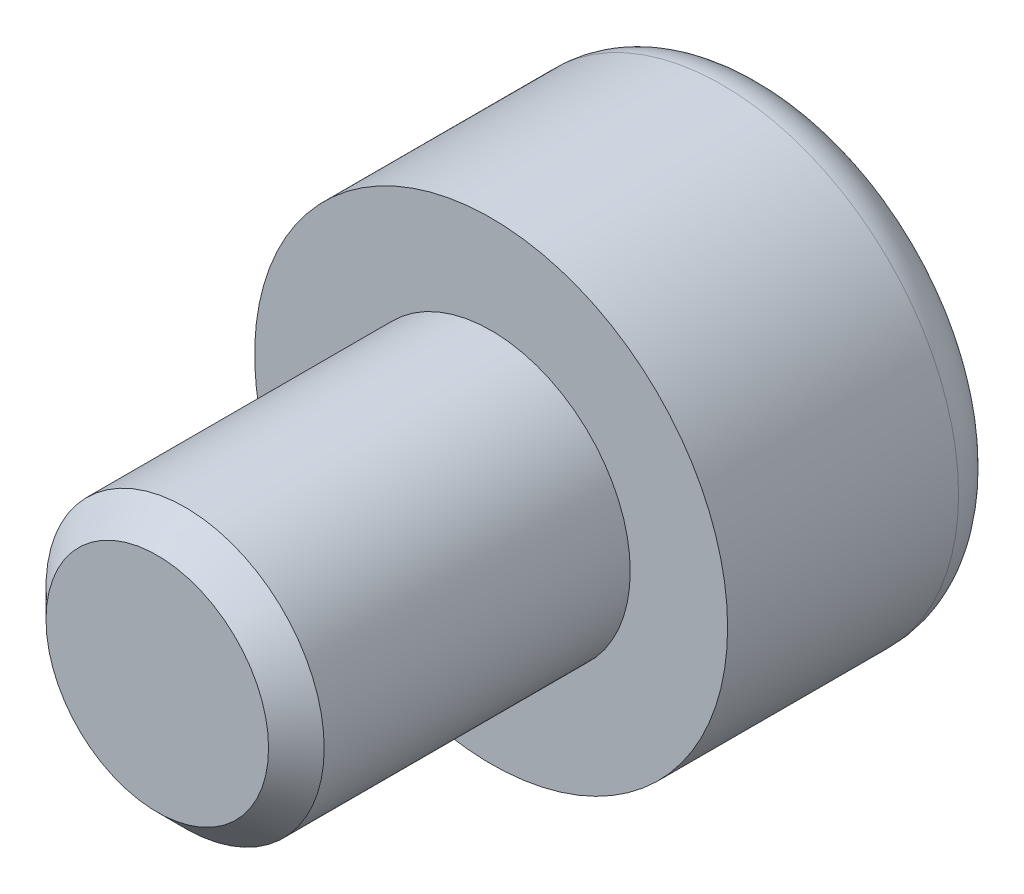
ISO-10303-21;
HEADER;
FILE_DESCRIPTION(('STEP AP214'),'2;1');
FILE_NAME('part.step','',(''),(''),'','','');
FILE_SCHEMA(('AUTOMOTIVE_DESIGN { 1 0 10303 214 1 1 1 1 }'));
ENDSEC;
DATA;
#1=APPLICATION_CONTEXT('core data for automotive mechanical design processes');
#2=APPLICATION_PROTOCOL_DEFINITION('international standard','automotive_design',2000,#1);
#3=PRODUCT_CONTEXT('',#1,'mechanical');
#4=PRODUCT('Part','Part','',(#3));
#5=PRODUCT_RELATED_PRODUCT_CATEGORY('part','',(#4));
#6=PRODUCT_DEFINITION_FORMATION('','',#4);
#7=PRODUCT_DEFINITION_CONTEXT('part definition',#1,'design');
#8=PRODUCT_DEFINITION('design','',#6,#7);
#9=PRODUCT_DEFINITION_SHAPE('','',#8);
#10=(LENGTH_UNIT() NAMED_UNIT(*) SI_UNIT(.MILLI.,.METRE.));
#11=(NAMED_UNIT(*) PLANE_ANGLE_UNIT() SI_UNIT($,.RADIAN.));
#12=(NAMED_UNIT(*) SI_UNIT($,.STERADIAN.) SOLID_ANGLE_UNIT());
#13=UNCERTAINTY_MEASURE_WITH_UNIT(LENGTH_MEASURE(1.E-05),#10,'distance_accuracy_value','');
#14=(GEOMETRIC_REPRESENTATION_CONTEXT(3) GLOBAL_UNCERTAINTY_ASSIGNED_CONTEXT((#13)) GLOBAL_UNIT_ASSIGNED_CONTEXT((#10,
#11,#12)) REPRESENTATION_CONTEXT('',''));
#15=CARTESIAN_POINT('',(0.,0.,0.));
#16=DIRECTION('',(0.,0.,1.));
#17=DIRECTION('',(1.,0.,0.));
#18=AXIS2_PLACEMENT_3D('',#15,#16,#17);
#19=CARTESIAN_POINT('',(0.,0.,6.));
#20=DIRECTION('',(0.,0.,-1.));
#21=DIRECTION('',(1.,0.,0.));
#22=AXIS2_PLACEMENT_3D('',#19,#20,#21);
#23=PLANE('',#22);
#24=CARTESIAN_POINT('',(0.,0.,6.));
#25=DIRECTION('',(0.,0.,1.));
#26=DIRECTION('',(1.,0.,0.));
#27=AXIS2_PLACEMENT_3D('',#24,#25,#26);
#28=CIRCLE('',#27,2.);
#29=CARTESIAN_POINT('',(2.,0.,6.));
#30=VERTEX_POINT('',#29);
#31=EDGE_CURVE('E11',#30,#30,#28,.T.);
#32=ORIENTED_EDGE('',*,*,#31,.T.);
#33=EDGE_LOOP('',(#32));
#34=FACE_BOUND('',#33,.T.);
#35=ADVANCED_FACE('F41',(#34),#23,.F.);
#36=CARTESIAN_POINT('',(0.,0.,6.));
#37=DIRECTION('',(0.,0.,-1.));
#38=DIRECTION('',(1.,0.,0.));
#39=AXIS2_PLACEMENT_3D('',#36,#37,#38);
#40=CONICAL_SURFACE('',#39,2.,0.785398163397);
#41=ORIENTED_EDGE('',*,*,#31,.F.);
#42=DIRECTION('',(0.707106781186548,0.,-0.707106781186548));
#43=VECTOR('',#42,1.);
#44=CARTESIAN_POINT('',(2.,0.,6.));
#45=LINE('',#44,#43);
#46=CARTESIAN_POINT('',(2.5,0.,5.5));
#47=VERTEX_POINT('',#46);
#48=EDGE_CURVE('E52',#30,#47,#45,.T.);
#49=ORIENTED_EDGE('',*,*,#48,.T.);
#50=CARTESIAN_POINT('',(0.,0.,5.5));
#51=DIRECTION('',(0.,0.,1.));
#52=DIRECTION('',(1.,0.,0.));
#53=AXIS2_PLACEMENT_3D('',#50,#51,#52);
#54=CIRCLE('',#53,2.5);
#55=EDGE_CURVE('E220',#47,#47,#54,.T.);
#56=ORIENTED_EDGE('',*,*,#55,.T.);
#57=ORIENTED_EDGE('',*,*,#48,.F.);
#58=EDGE_LOOP('',(#41,#49,#56,#57));
#59=FACE_BOUND('',#58,.T.);
#60=ADVANCED_FACE('F234',(#59),#40,.T.);
#61=CARTESIAN_POINT('',(0.,0.,5.5));
#62=DIRECTION('',(0.,0.,-1.));
#63=DIRECTION('',(1.,0.,0.));
#64=AXIS2_PLACEMENT_3D('',#61,#62,#63);
#65=CYLINDRICAL_SURFACE('',#64,2.5);
#66=ORIENTED_EDGE('',*,*,#55,.F.);
#67=DIRECTION('',(0.,0.,-1.));
#68=VECTOR('',#67,1.);
#69=CARTESIAN_POINT('',(2.5,0.,5.5));
#70=LINE('',#69,#68);
#71=CARTESIAN_POINT('',(2.5,0.,0.));
#72=VERTEX_POINT('',#71);
#73=EDGE_CURVE('E200',#47,#72,#70,.T.);
#74=ORIENTED_EDGE('',*,*,#73,.T.);
#75=CARTESIAN_POINT('',(0.,0.,0.));
#76=DIRECTION('',(0.,0.,1.));
#77=DIRECTION('',(1.,0.,0.));
#78=AXIS2_PLACEMENT_3D('',#75,#76,#77);
#79=CIRCLE('',#78,2.5);
#80=EDGE_CURVE('E190',#72,#72,#79,.T.);
#81=ORIENTED_EDGE('',*,*,#80,.T.);
#82=ORIENTED_EDGE('',*,*,#73,.F.);
#83=EDGE_LOOP('',(#66,#74,#81,#82));
#84=FACE_BOUND('',#83,.T.);
#85=ADVANCED_FACE('F242',(#84),#65,.T.);
#86=CARTESIAN_POINT('',(0.,0.,0.));
#87=DIRECTION('',(0.,0.,-1.));
#88=DIRECTION('',(1.,0.,0.));
#89=AXIS2_PLACEMENT_3D('',#86,#87,#88);
#90=PLANE('',#89);
#91=ORIENTED_EDGE('',*,*,#80,.F.);
#92=EDGE_LOOP('',(#91));
#93=FACE_BOUND('',#92,.T.);
#94=CARTESIAN_POINT('',(0.,0.,0.));
#95=DIRECTION('',(0.,0.,1.));
#96=DIRECTION('',(1.,0.,0.));
#97=AXIS2_PLACEMENT_3D('',#94,#95,#96);
#98=CIRCLE('',#97,4.25);
#99=CARTESIAN_POINT('',(4.25,0.,0.));
#100=VERTEX_POINT('',#99);
#101=EDGE_CURVE('E186',#100,#100,#98,.T.);
#102=ORIENTED_EDGE('',*,*,#101,.T.);
#103=EDGE_LOOP('',(#102));
#104=FACE_BOUND('',#103,.T.);
#105=ADVANCED_FACE('F247',(#93,#104),#90,.F.);
#106=CARTESIAN_POINT('',(0.,0.,0.));
#107=DIRECTION('',(0.,0.,-1.));
#108=DIRECTION('',(1.,0.,0.));
#109=AXIS2_PLACEMENT_3D('',#106,#107,#108);
#110=CYLINDRICAL_SURFACE('',#109,4.25);
#111=ORIENTED_EDGE('',*,*,#101,.F.);
#112=DIRECTION('',(0.,0.,-1.));
#113=VECTOR('',#112,1.);
#114=CARTESIAN_POINT('',(4.25,0.,0.));
#115=LINE('',#114,#113);
#116=CARTESIAN_POINT('',(4.25,0.,-4.15));
#117=VERTEX_POINT('',#116);
#118=EDGE_CURVE('E191',#100,#117,#115,.T.);
#119=ORIENTED_EDGE('',*,*,#118,.T.);
#120=CARTESIAN_POINT('',(0.,0.,-4.15));
#121=DIRECTION('',(0.,0.,1.));
#122=DIRECTION('',(1.,0.,0.));
#123=AXIS2_PLACEMENT_3D('',#120,#121,#122);
#124=CIRCLE('',#123,4.25);
#125=EDGE_CURVE('E173',#117,#117,#124,.T.);
#126=ORIENTED_EDGE('',*,*,#125,.T.);
#127=ORIENTED_EDGE('',*,*,#118,.F.);
#128=EDGE_LOOP('',(#111,#119,#126,#127));
#129=FACE_BOUND('',#128,.T.);
#130=ADVANCED_FACE('F250',(#129),#110,.T.);
#131=CARTESIAN_POINT('',(0.,0.,-4.15));
#132=DIRECTION('',(0.,0.,-1.));
#133=DIRECTION('',(1.,0.,0.));
#134=AXIS2_PLACEMENT_3D('',#131,#132,#133);
#135=TOROIDAL_SURFACE('',#134,3.4,0.85);
#136=ORIENTED_EDGE('',*,*,#125,.F.);
#137=CARTESIAN_POINT('',(3.4,0.,-4.15));
#138=DIRECTION('',(0.,1.,0.));
#139=DIRECTION('',(1.,0.,0.));
#140=AXIS2_PLACEMENT_3D('',#137,#138,#139);
#141=CIRCLE('',#140,0.85);
#142=CARTESIAN_POINT('',(3.4,0.,-5.));
#143=VERTEX_POINT('',#142);
#144=EDGE_CURVE('E181',#117,#143,#141,.T.);
#145=ORIENTED_EDGE('',*,*,#144,.T.);
#146=CARTESIAN_POINT('',(0.,0.,-5.));
#147=DIRECTION('',(0.,0.,1.));
#148=DIRECTION('',(1.,0.,0.));
#149=AXIS2_PLACEMENT_3D('',#146,#147,#148);
#150=CIRCLE('',#149,3.4);
#151=EDGE_CURVE('E176',#143,#143,#150,.T.);
#152=ORIENTED_EDGE('',*,*,#151,.T.);
#153=ORIENTED_EDGE('',*,*,#144,.F.);
#154=EDGE_LOOP('',(#136,#145,#152,#153));
#155=FACE_BOUND('',#154,.T.);
#156=ADVANCED_FACE('F255',(#155),#135,.T.);
#157=CARTESIAN_POINT('',(0.,0.,-5.));
#158=DIRECTION('',(0.,0.,-1.));
#159=DIRECTION('',(1.,0.,0.));
#160=AXIS2_PLACEMENT_3D('',#157,#158,#159);
#161=PLANE('',#160);
#162=ORIENTED_EDGE('',*,*,#151,.F.);
#163=EDGE_LOOP('',(#162));
#164=FACE_BOUND('',#163,.T.);
#165=DIRECTION('',(1.,0.,0.));
#166=VECTOR('',#165,1.);
#167=CARTESIAN_POINT('',(-1.155,-2.000518682742,-5.));
#168=LINE('',#167,#166);
#169=CARTESIAN_POINT('',(-1.155,-2.000518682742,-5.));
#170=VERTEX_POINT('',#169);
#171=CARTESIAN_POINT('',(1.155,-2.000518682742,-5.));
#172=VERTEX_POINT('',#171);
#173=EDGE_CURVE('E184',#170,#172,#168,.T.);
#174=ORIENTED_EDGE('',*,*,#173,.T.);
#175=DIRECTION('',(0.50000000000019,0.866025403784329,0.));
#176=VECTOR('',#175,1.);
#177=CARTESIAN_POINT('',(1.155,-2.000518682742,-5.));
#178=LINE('',#177,#176);
#179=CARTESIAN_POINT('',(2.31,0.,-5.));
#180=VERTEX_POINT('',#179);
#181=EDGE_CURVE('E177',#172,#180,#178,.T.);
#182=ORIENTED_EDGE('',*,*,#181,.T.);
#183=DIRECTION('',(-0.50000000000019,0.866025403784329,0.));
#184=VECTOR('',#183,1.);
#185=CARTESIAN_POINT('',(2.31,0.,-5.));
#186=LINE('',#185,#184);
#187=CARTESIAN_POINT('',(1.155,2.000518682742,-5.));
#188=VERTEX_POINT('',#187);
#189=EDGE_CURVE('E150',#180,#188,#186,.T.);
#190=ORIENTED_EDGE('',*,*,#189,.T.);
#191=DIRECTION('',(-1.,0.,0.));
#192=VECTOR('',#191,1.);
#193=CARTESIAN_POINT('',(1.155,2.000518682742,-5.));
#194=LINE('',#193,#192);
#195=CARTESIAN_POINT('',(-1.155,2.000518682742,-5.));
#196=VERTEX_POINT('',#195);
#197=EDGE_CURVE('E159',#188,#196,#194,.T.);
#198=ORIENTED_EDGE('',*,*,#197,.T.);
#199=DIRECTION('',(-0.50000000000019,-0.866025403784329,0.));
#200=VECTOR('',#199,1.);
#201=CARTESIAN_POINT('',(-1.155,2.000518682742,-5.));
#202=LINE('',#201,#200);
#203=CARTESIAN_POINT('',(-2.31,0.,-5.));
#204=VERTEX_POINT('',#203);
#205=EDGE_CURVE('E45',#196,#204,#202,.T.);
#206=ORIENTED_EDGE('',*,*,#205,.T.);
#207=DIRECTION('',(0.50000000000019,-0.866025403784329,0.));
#208=VECTOR('',#207,1.);
#209=CARTESIAN_POINT('',(-2.31,0.,-5.));
#210=LINE('',#209,#208);
#211=EDGE_CURVE('E204',#204,#170,#210,.T.);
#212=ORIENTED_EDGE('',*,*,#211,.T.);
#213=EDGE_LOOP('',(#174,#182,#190,#198,#206,#212));
#214=FACE_BOUND('',#213,.T.);
#215=ADVANCED_FACE('F258',(#164,#214),#161,.T.);
#216=CARTESIAN_POINT('',(1.155,-2.000518682742,-2.5));
#217=DIRECTION('',(-0.866025403784329,0.50000000000019,0.));
#218=DIRECTION('',(0.,0.,-1.));
#219=AXIS2_PLACEMENT_3D('',#216,#217,#218);
#220=PLANE('',#219);
#221=DIRECTION('',(0.,0.,-1.));
#222=VECTOR('',#221,1.);
#223=CARTESIAN_POINT('',(1.155,-2.000518682742,-2.5));
#224=LINE('',#223,#222);
#225=CARTESIAN_POINT('',(1.155,-2.000518682742,-2.5));
#226=VERTEX_POINT('',#225);
#227=EDGE_CURVE('E139',#226,#172,#224,.T.);
#228=ORIENTED_EDGE('',*,*,#227,.F.);
#229=DIRECTION('',(0.50000000000019,0.866025403784329,0.));
#230=VECTOR('',#229,1.);
#231=CARTESIAN_POINT('',(1.155,-2.000518682742,-2.5));
#232=LINE('',#231,#230);
#233=CARTESIAN_POINT('',(2.31,0.,-2.5));
#234=VERTEX_POINT('',#233);
#235=EDGE_CURVE('E148',#226,#234,#232,.T.);
#236=ORIENTED_EDGE('',*,*,#235,.T.);
#237=DIRECTION('',(0.,0.,-1.));
#238=VECTOR('',#237,1.);
#239=CARTESIAN_POINT('',(2.31,0.,-2.5));
#240=LINE('',#239,#238);
#241=EDGE_CURVE('E153',#234,#180,#240,.T.);
#242=ORIENTED_EDGE('',*,*,#241,.T.);
#243=ORIENTED_EDGE('',*,*,#181,.F.);
#244=EDGE_LOOP('',(#228,#236,#242,#243));
#245=FACE_BOUND('',#244,.T.);
#246=ADVANCED_FACE('F161',(#245),#220,.T.);
#247=CARTESIAN_POINT('',(-1.155,-2.000518682742,-2.5));
#248=DIRECTION('',(0.,1.,0.));
#249=DIRECTION('',(1.,0.,0.));
#250=AXIS2_PLACEMENT_3D('',#247,#248,#249);
#251=PLANE('',#250);
#252=DIRECTION('',(0.,0.,-1.));
#253=VECTOR('',#252,1.);
#254=CARTESIAN_POINT('',(-1.155,-2.000518682742,-2.5));
#255=LINE('',#254,#253);
#256=CARTESIAN_POINT('',(-1.155,-2.000518682742,-2.5));
#257=VERTEX_POINT('',#256);
#258=EDGE_CURVE('E182',#257,#170,#255,.T.);
#259=ORIENTED_EDGE('',*,*,#258,.F.);
#260=DIRECTION('',(1.,0.,0.));
#261=VECTOR('',#260,1.);
#262=CARTESIAN_POINT('',(-1.155,-2.000518682742,-2.5));
#263=LINE('',#262,#261);
#264=EDGE_CURVE('E163',#257,#226,#263,.T.);
#265=ORIENTED_EDGE('',*,*,#264,.T.);
#266=ORIENTED_EDGE('',*,*,#227,.T.);
#267=ORIENTED_EDGE('',*,*,#173,.F.);
#268=EDGE_LOOP('',(#259,#265,#266,#267));
#269=FACE_BOUND('',#268,.T.);
#270=ADVANCED_FACE('F265',(#269),#251,.T.);
#271=CARTESIAN_POINT('',(-2.31,0.,-2.5));
#272=DIRECTION('',(0.866025403784329,0.50000000000019,0.));
#273=DIRECTION('',(0.,0.,1.));
#274=AXIS2_PLACEMENT_3D('',#271,#272,#273);
#275=PLANE('',#274);
#276=DIRECTION('',(0.,0.,-1.));
#277=VECTOR('',#276,1.);
#278=CARTESIAN_POINT('',(-2.31,0.,-2.5));
#279=LINE('',#278,#277);
#280=CARTESIAN_POINT('',(-2.31,0.,-2.5));
#281=VERTEX_POINT('',#280);
#282=EDGE_CURVE('E201',#281,#204,#279,.T.);
#283=ORIENTED_EDGE('',*,*,#282,.F.);
#284=DIRECTION('',(0.50000000000019,-0.866025403784329,0.));
#285=VECTOR('',#284,1.);
#286=CARTESIAN_POINT('',(-2.31,0.,-2.5));
#287=LINE('',#286,#285);
#288=EDGE_CURVE('E169',#281,#257,#287,.T.);
#289=ORIENTED_EDGE('',*,*,#288,.T.);
#290=ORIENTED_EDGE('',*,*,#258,.T.);
#291=ORIENTED_EDGE('',*,*,#211,.F.);
#292=EDGE_LOOP('',(#283,#289,#290,#291));
#293=FACE_BOUND('',#292,.T.);
#294=ADVANCED_FACE('F267',(#293),#275,.T.);
#295=CARTESIAN_POINT('',(-1.155,2.000518682742,-2.5));
#296=DIRECTION('',(0.866025403784329,-0.50000000000019,0.));
#297=DIRECTION('',(0.,0.,1.));
#298=AXIS2_PLACEMENT_3D('',#295,#296,#297);
#299=PLANE('',#298);
#300=DIRECTION('',(0.,0.,-1.));
#301=VECTOR('',#300,1.);
#302=CARTESIAN_POINT('',(-1.155,2.000518682742,-2.5));
#303=LINE('',#302,#301);
#304=CARTESIAN_POINT('',(-1.155,2.000518682742,-2.5));
#305=VERTEX_POINT('',#304);
#306=EDGE_CURVE('E214',#305,#196,#303,.T.);
#307=ORIENTED_EDGE('',*,*,#306,.F.);
#308=DIRECTION('',(-0.50000000000019,-0.866025403784329,0.));
#309=VECTOR('',#308,1.);
#310=CARTESIAN_POINT('',(-1.155,2.000518682742,-2.5));
#311=LINE('',#310,#309);
#312=EDGE_CURVE('E194',#305,#281,#311,.T.);
#313=ORIENTED_EDGE('',*,*,#312,.T.);
#314=ORIENTED_EDGE('',*,*,#282,.T.);
#315=ORIENTED_EDGE('',*,*,#205,.F.);
#316=EDGE_LOOP('',(#307,#313,#314,#315));
#317=FACE_BOUND('',#316,.T.);
#318=ADVANCED_FACE('F43',(#317),#299,.T.);
#319=CARTESIAN_POINT('',(1.155,2.000518682742,-2.5));
#320=DIRECTION('',(0.,-1.,0.));
#321=DIRECTION('',(-1.,0.,0.));
#322=AXIS2_PLACEMENT_3D('',#319,#320,#321);
#323=PLANE('',#322);
#324=DIRECTION('',(0.,0.,-1.));
#325=VECTOR('',#324,1.);
#326=CARTESIAN_POINT('',(1.155,2.000518682742,-2.5));
#327=LINE('',#326,#325);
#328=CARTESIAN_POINT('',(1.155,2.000518682742,-2.5));
#329=VERTEX_POINT('',#328);
#330=EDGE_CURVE('E195',#329,#188,#327,.T.);
#331=ORIENTED_EDGE('',*,*,#330,.F.);
#332=DIRECTION('',(-1.,0.,0.));
#333=VECTOR('',#332,1.);
#334=CARTESIAN_POINT('',(1.155,2.000518682742,-2.5));
#335=LINE('',#334,#333);
#336=EDGE_CURVE('E115',#329,#305,#335,.T.);
#337=ORIENTED_EDGE('',*,*,#336,.T.);
#338=ORIENTED_EDGE('',*,*,#306,.T.);
#339=ORIENTED_EDGE('',*,*,#197,.F.);
#340=EDGE_LOOP('',(#331,#337,#338,#339));
#341=FACE_BOUND('',#340,.T.);
#342=ADVANCED_FACE('F260',(#341),#323,.T.);
#343=CARTESIAN_POINT('',(2.31,0.,-2.5));
#344=DIRECTION('',(-0.866025403784329,-0.50000000000019,0.));
#345=DIRECTION('',(-0.50000000000019,0.866025403784329,0.));
#346=AXIS2_PLACEMENT_3D('',#343,#344,#345);
#347=PLANE('',#346);
#348=ORIENTED_EDGE('',*,*,#241,.F.);
#349=DIRECTION('',(-0.50000000000019,0.866025403784329,0.));
#350=VECTOR('',#349,1.);
#351=CARTESIAN_POINT('',(2.31,0.,-2.5));
#352=LINE('',#351,#350);
#353=EDGE_CURVE('E125',#234,#329,#352,.T.);
#354=ORIENTED_EDGE('',*,*,#353,.T.);
#355=ORIENTED_EDGE('',*,*,#330,.T.);
#356=ORIENTED_EDGE('',*,*,#189,.F.);
#357=EDGE_LOOP('',(#348,#354,#355,#356));
#358=FACE_BOUND('',#357,.T.);
#359=ADVANCED_FACE('F154',(#358),#347,.T.);
#360=CARTESIAN_POINT('',(0.,0.,-2.5));
#361=DIRECTION('',(0.,0.,-1.));
#362=DIRECTION('',(1.,0.,0.));
#363=AXIS2_PLACEMENT_3D('',#360,#361,#362);
#364=PLANE('',#363);
#365=ORIENTED_EDGE('',*,*,#353,.F.);
#366=ORIENTED_EDGE('',*,*,#235,.F.);
#367=ORIENTED_EDGE('',*,*,#264,.F.);
#368=ORIENTED_EDGE('',*,*,#288,.F.);
#369=ORIENTED_EDGE('',*,*,#312,.F.);
#370=ORIENTED_EDGE('',*,*,#336,.F.);
#371=EDGE_LOOP('',(#365,#366,#367,#368,#369,#370));
#372=FACE_BOUND('',#371,.T.);
#373=ADVANCED_FACE('F145',(#372),#364,.T.);
#374=CLOSED_SHELL('',(#35,#60,#85,#105,#130,#156,#215,#246,#270,#294,#318,#342,#359,#373));
#375=MANIFOLD_SOLID_BREP('B2',#374);
#376=ADVANCED_BREP_SHAPE_REPRESENTATION('',(#18,#375),#14);
#377=SHAPE_DEFINITION_REPRESENTATION(#9,#376);
ENDSEC;
END-ISO-10303-21;
